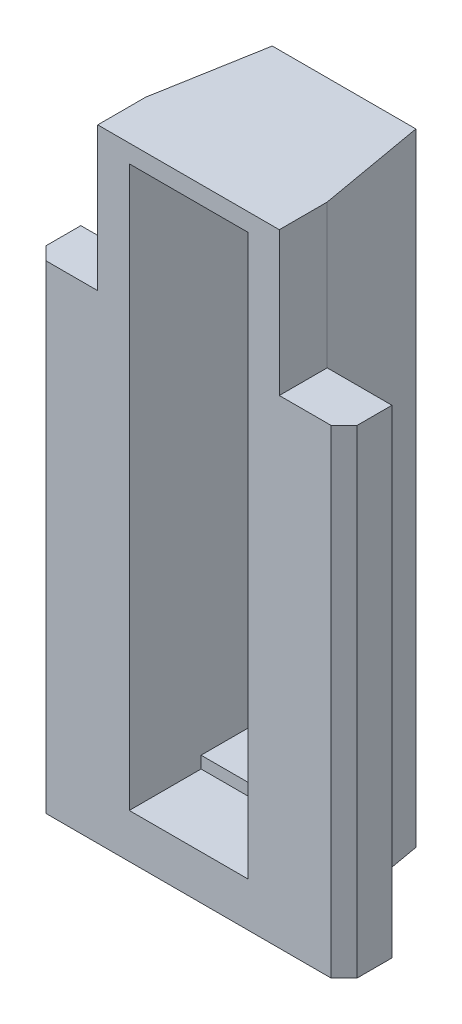
ISO-10303-21;
HEADER;
FILE_DESCRIPTION(('STEP AP214'),'2;1');
FILE_NAME('part.step','',(''),(''),'','','');
FILE_SCHEMA(('AUTOMOTIVE_DESIGN { 1 0 10303 214 1 1 1 1 }'));
ENDSEC;
DATA;
#1=APPLICATION_CONTEXT('core data for automotive mechanical design processes');
#2=APPLICATION_PROTOCOL_DEFINITION('international standard','automotive_design',2000,#1);
#3=PRODUCT_CONTEXT('',#1,'mechanical');
#4=PRODUCT('Part','Part','',(#3));
#5=PRODUCT_RELATED_PRODUCT_CATEGORY('part','',(#4));
#6=PRODUCT_DEFINITION_FORMATION('','',#4);
#7=PRODUCT_DEFINITION_CONTEXT('part definition',#1,'design');
#8=PRODUCT_DEFINITION('design','',#6,#7);
#9=PRODUCT_DEFINITION_SHAPE('','',#8);
#10=(LENGTH_UNIT() NAMED_UNIT(*) SI_UNIT(.MILLI.,.METRE.));
#11=(NAMED_UNIT(*) PLANE_ANGLE_UNIT() SI_UNIT($,.RADIAN.));
#12=(NAMED_UNIT(*) SI_UNIT($,.STERADIAN.) SOLID_ANGLE_UNIT());
#13=UNCERTAINTY_MEASURE_WITH_UNIT(LENGTH_MEASURE(1.E-05),#10,'distance_accuracy_value','');
#14=(GEOMETRIC_REPRESENTATION_CONTEXT(3) GLOBAL_UNCERTAINTY_ASSIGNED_CONTEXT((#13)) GLOBAL_UNIT_ASSIGNED_CONTEXT((#10,
#11,#12)) REPRESENTATION_CONTEXT('',''));
#15=CARTESIAN_POINT('',(0.,0.,0.));
#16=DIRECTION('',(0.,0.,1.));
#17=DIRECTION('',(1.,0.,0.));
#18=AXIS2_PLACEMENT_3D('',#15,#16,#17);
#19=CARTESIAN_POINT('',(0.,6.85,-13.));
#20=DIRECTION('',(0.,0.,1.));
#21=DIRECTION('',(1.,0.,0.));
#22=AXIS2_PLACEMENT_3D('',#19,#20,#21);
#23=CYLINDRICAL_SURFACE('',#22,1.15);
#24=CARTESIAN_POINT('',(0.,6.85,-10.));
#25=DIRECTION('',(0.,0.,1.));
#26=DIRECTION('',(-1.,0.,0.));
#27=AXIS2_PLACEMENT_3D('',#24,#25,#26);
#28=CIRCLE('',#27,1.15);
#29=CARTESIAN_POINT('',(-1.14999999999999,6.85,-10.));
#30=VERTEX_POINT('',#29);
#31=EDGE_CURVE('E410',#30,#30,#28,.T.);
#32=ORIENTED_EDGE('',*,*,#31,.T.);
#33=EDGE_LOOP('',(#32));
#34=FACE_BOUND('',#33,.T.);
#35=CARTESIAN_POINT('',(0.,6.85,-11.8));
#36=DIRECTION('',(0.,0.,-1.));
#37=DIRECTION('',(-1.,0.,0.));
#38=AXIS2_PLACEMENT_3D('',#35,#36,#37);
#39=CIRCLE('',#38,1.15);
#40=CARTESIAN_POINT('',(-1.14999999999999,6.85,-11.8));
#41=VERTEX_POINT('',#40);
#42=EDGE_CURVE('E44',#41,#41,#39,.F.);
#43=ORIENTED_EDGE('',*,*,#42,.F.);
#44=EDGE_LOOP('',(#43));
#45=FACE_BOUND('',#44,.T.);
#46=ADVANCED_FACE('F39',(#34,#45),#23,.F.);
#47=CARTESIAN_POINT('',(0.,47.85,-13.));
#48=DIRECTION('',(0.,0.,1.));
#49=DIRECTION('',(1.,0.,0.));
#50=AXIS2_PLACEMENT_3D('',#47,#48,#49);
#51=CYLINDRICAL_SURFACE('',#50,1.15);
#52=CARTESIAN_POINT('',(0.,47.85,-10.));
#53=DIRECTION('',(0.,0.,1.));
#54=DIRECTION('',(1.,0.,0.));
#55=AXIS2_PLACEMENT_3D('',#52,#53,#54);
#56=CIRCLE('',#55,1.15);
#57=CARTESIAN_POINT('',(1.15,47.85,-10.));
#58=VERTEX_POINT('',#57);
#59=EDGE_CURVE('E254',#58,#58,#56,.T.);
#60=ORIENTED_EDGE('',*,*,#59,.T.);
#61=EDGE_LOOP('',(#60));
#62=FACE_BOUND('',#61,.T.);
#63=CARTESIAN_POINT('',(0.,47.85,-11.8));
#64=DIRECTION('',(0.,0.,-1.));
#65=DIRECTION('',(-1.,0.,0.));
#66=AXIS2_PLACEMENT_3D('',#63,#64,#65);
#67=CIRCLE('',#66,1.15);
#68=CARTESIAN_POINT('',(-1.15,47.85,-11.8));
#69=VERTEX_POINT('',#68);
#70=EDGE_CURVE('E404',#69,#69,#67,.F.);
#71=ORIENTED_EDGE('',*,*,#70,.F.);
#72=EDGE_LOOP('',(#71));
#73=FACE_BOUND('',#72,.T.);
#74=ADVANCED_FACE('F464',(#62,#73),#51,.F.);
#75=CARTESIAN_POINT('',(-4.95000000000001,4.7,-59.3691707926722));
#76=DIRECTION('',(0.,-1.,0.));
#77=DIRECTION('',(0.,0.,-1.));
#78=AXIS2_PLACEMENT_3D('',#75,#76,#77);
#79=PLANE('',#78);
#80=DIRECTION('',(1.,0.,0.));
#81=VECTOR('',#80,1.);
#82=CARTESIAN_POINT('',(-4.95000000000001,4.7,-6.));
#83=LINE('',#82,#81);
#84=CARTESIAN_POINT('',(-4.95000000000001,4.7,-6.));
#85=VERTEX_POINT('',#84);
#86=CARTESIAN_POINT('',(4.94999999999999,4.7,-6.));
#87=VERTEX_POINT('',#86);
#88=EDGE_CURVE('E57',#85,#87,#83,.T.);
#89=ORIENTED_EDGE('',*,*,#88,.T.);
#90=DIRECTION('',(0.,0.,1.));
#91=VECTOR('',#90,1.);
#92=CARTESIAN_POINT('',(4.94999999999999,4.7,-59.3691707926722));
#93=LINE('',#92,#91);
#94=CARTESIAN_POINT('',(4.94999999999999,4.7,-10.));
#95=VERTEX_POINT('',#94);
#96=EDGE_CURVE('E291',#95,#87,#93,.T.);
#97=ORIENTED_EDGE('',*,*,#96,.F.);
#98=DIRECTION('',(-1.,0.,0.));
#99=VECTOR('',#98,1.);
#100=CARTESIAN_POINT('',(-4.95000000000001,4.7,-9.99999999999999));
#101=LINE('',#100,#99);
#102=CARTESIAN_POINT('',(-4.95000000000001,4.7,-9.99999999999999));
#103=VERTEX_POINT('',#102);
#104=EDGE_CURVE('E290',#95,#103,#101,.T.);
#105=ORIENTED_EDGE('',*,*,#104,.T.);
#106=DIRECTION('',(0.,0.,1.));
#107=VECTOR('',#106,1.);
#108=CARTESIAN_POINT('',(-4.95000000000001,4.7,-59.3691707926722));
#109=LINE('',#108,#107);
#110=EDGE_CURVE('E300',#103,#85,#109,.T.);
#111=ORIENTED_EDGE('',*,*,#110,.T.);
#112=EDGE_LOOP('',(#89,#97,#105,#111));
#113=FACE_BOUND('',#112,.T.);
#114=ADVANCED_FACE('F445',(#113),#79,.F.);
#115=CARTESIAN_POINT('',(-4.95000000000001,50.,-59.3691707926722));
#116=DIRECTION('',(0.,1.,0.));
#117=DIRECTION('',(0.,0.,1.));
#118=AXIS2_PLACEMENT_3D('',#115,#116,#117);
#119=PLANE('',#118);
#120=DIRECTION('',(-1.,0.,0.));
#121=VECTOR('',#120,1.);
#122=CARTESIAN_POINT('',(-4.95000000000001,50.,-6.));
#123=LINE('',#122,#121);
#124=CARTESIAN_POINT('',(4.94999999999999,50.,-6.));
#125=VERTEX_POINT('',#124);
#126=CARTESIAN_POINT('',(-4.95000000000001,50.,-6.));
#127=VERTEX_POINT('',#126);
#128=EDGE_CURVE('E244',#125,#127,#123,.T.);
#129=ORIENTED_EDGE('',*,*,#128,.T.);
#130=DIRECTION('',(0.,0.,1.));
#131=VECTOR('',#130,1.);
#132=CARTESIAN_POINT('',(-4.95000000000001,50.,-59.3691707926722));
#133=LINE('',#132,#131);
#134=CARTESIAN_POINT('',(-4.95000000000001,50.,-9.99999999999999));
#135=VERTEX_POINT('',#134);
#136=EDGE_CURVE('E303',#135,#127,#133,.T.);
#137=ORIENTED_EDGE('',*,*,#136,.F.);
#138=DIRECTION('',(1.,0.,0.));
#139=VECTOR('',#138,1.);
#140=CARTESIAN_POINT('',(-4.95000000000001,50.,-9.99999999999999));
#141=LINE('',#140,#139);
#142=CARTESIAN_POINT('',(4.94999999999999,50.,-10.));
#143=VERTEX_POINT('',#142);
#144=EDGE_CURVE('E294',#135,#143,#141,.T.);
#145=ORIENTED_EDGE('',*,*,#144,.T.);
#146=DIRECTION('',(0.,0.,1.));
#147=VECTOR('',#146,1.);
#148=CARTESIAN_POINT('',(4.94999999999999,50.,-59.3691707926722));
#149=LINE('',#148,#147);
#150=EDGE_CURVE('E297',#143,#125,#149,.T.);
#151=ORIENTED_EDGE('',*,*,#150,.T.);
#152=EDGE_LOOP('',(#129,#137,#145,#151));
#153=FACE_BOUND('',#152,.T.);
#154=ADVANCED_FACE('F437',(#153),#119,.F.);
#155=CARTESIAN_POINT('',(0.,40.,0.));
#156=DIRECTION('',(0.,1.,0.));
#157=DIRECTION('',(0.,0.,1.));
#158=AXIS2_PLACEMENT_3D('',#155,#156,#157);
#159=PLANE('',#158);
#160=DIRECTION('',(1.,0.,0.));
#161=VECTOR('',#160,1.);
#162=CARTESIAN_POINT('',(-13.,40.,0.));
#163=LINE('',#162,#161);
#164=CARTESIAN_POINT('',(7.58694282637616,40.,0.));
#165=VERTEX_POINT('',#164);
#166=CARTESIAN_POINT('',(11.9,40.,0.));
#167=VERTEX_POINT('',#166);
#168=EDGE_CURVE('E353',#165,#167,#163,.T.);
#169=ORIENTED_EDGE('',*,*,#168,.T.);
#170=DIRECTION('',(-0.707106781186549,0.,0.707106781186546));
#171=VECTOR('',#170,1.);
#172=CARTESIAN_POINT('',(5.94999999999997,40.,5.94999999999999));
#173=LINE('',#172,#171);
#174=CARTESIAN_POINT('',(13.,40.,-1.1));
#175=VERTEX_POINT('',#174);
#176=EDGE_CURVE('E402',#167,#175,#173,.F.);
#177=ORIENTED_EDGE('',*,*,#176,.T.);
#178=DIRECTION('',(0.,0.,-1.));
#179=VECTOR('',#178,1.);
#180=CARTESIAN_POINT('',(13.,40.,0.));
#181=LINE('',#180,#179);
#182=CARTESIAN_POINT('',(13.,40.,-4.));
#183=VERTEX_POINT('',#182);
#184=EDGE_CURVE('E343',#175,#183,#181,.T.);
#185=ORIENTED_EDGE('',*,*,#184,.T.);
#186=DIRECTION('',(-1.,0.,0.));
#187=VECTOR('',#186,1.);
#188=CARTESIAN_POINT('',(13.,40.,-4.));
#189=LINE('',#188,#187);
#190=CARTESIAN_POINT('',(7.58694282637617,40.,-4.));
#191=VERTEX_POINT('',#190);
#192=EDGE_CURVE('E345',#183,#191,#189,.T.);
#193=ORIENTED_EDGE('',*,*,#192,.T.);
#194=DIRECTION('',(0.,0.,-1.));
#195=VECTOR('',#194,1.);
#196=CARTESIAN_POINT('',(7.58694282637616,40.,0.));
#197=LINE('',#196,#195);
#198=EDGE_CURVE('E309',#165,#191,#197,.T.);
#199=ORIENTED_EDGE('',*,*,#198,.F.);
#200=EDGE_LOOP('',(#169,#177,#185,#193,#199));
#201=FACE_BOUND('',#200,.T.);
#202=ADVANCED_FACE('F506',(#201),#159,.T.);
#203=CARTESIAN_POINT('',(13.,40.,0.));
#204=DIRECTION('',(-1.,0.,0.));
#205=DIRECTION('',(0.,0.,1.));
#206=AXIS2_PLACEMENT_3D('',#203,#204,#205);
#207=PLANE('',#206);
#208=ORIENTED_EDGE('',*,*,#184,.F.);
#209=DIRECTION('',(0.,-1.,0.));
#210=VECTOR('',#209,1.);
#211=CARTESIAN_POINT('',(13.,40.,-1.1));
#212=LINE('',#211,#210);
#213=CARTESIAN_POINT('',(13.,0.,-1.1));
#214=VERTEX_POINT('',#213);
#215=EDGE_CURVE('E390',#175,#214,#212,.T.);
#216=ORIENTED_EDGE('',*,*,#215,.T.);
#217=DIRECTION('',(0.,0.,-1.));
#218=VECTOR('',#217,1.);
#219=CARTESIAN_POINT('',(13.,0.,0.));
#220=LINE('',#219,#218);
#221=CARTESIAN_POINT('',(13.,0.,-4.));
#222=VERTEX_POINT('',#221);
#223=EDGE_CURVE('E342',#214,#222,#220,.T.);
#224=ORIENTED_EDGE('',*,*,#223,.T.);
#225=DIRECTION('',(0.,-1.,0.));
#226=VECTOR('',#225,1.);
#227=CARTESIAN_POINT('',(13.,40.,-4.));
#228=LINE('',#227,#226);
#229=EDGE_CURVE('E387',#183,#222,#228,.T.);
#230=ORIENTED_EDGE('',*,*,#229,.F.);
#231=EDGE_LOOP('',(#208,#216,#224,#230));
#232=FACE_BOUND('',#231,.T.);
#233=ADVANCED_FACE('F555',(#232),#207,.F.);
#234=CARTESIAN_POINT('',(13.,40.,-4.));
#235=DIRECTION('',(0.,0.,1.));
#236=DIRECTION('',(1.,0.,0.));
#237=AXIS2_PLACEMENT_3D('',#234,#235,#236);
#238=PLANE('',#237);
#239=DIRECTION('',(-1.,0.,0.));
#240=VECTOR('',#239,1.);
#241=CARTESIAN_POINT('',(13.,0.,-4.));
#242=LINE('',#241,#240);
#243=CARTESIAN_POINT('',(7.58694282637617,0.,-4.));
#244=VERTEX_POINT('',#243);
#245=EDGE_CURVE('E358',#222,#244,#242,.T.);
#246=ORIENTED_EDGE('',*,*,#245,.T.);
#247=DIRECTION('',(0.,-1.,0.));
#248=VECTOR('',#247,1.);
#249=CARTESIAN_POINT('',(7.58694282637617,40.,-4.));
#250=LINE('',#249,#248);
#251=EDGE_CURVE('E384',#191,#244,#250,.T.);
#252=ORIENTED_EDGE('',*,*,#251,.F.);
#253=ORIENTED_EDGE('',*,*,#192,.F.);
#254=ORIENTED_EDGE('',*,*,#229,.T.);
#255=EDGE_LOOP('',(#246,#252,#253,#254));
#256=FACE_BOUND('',#255,.T.);
#257=ADVANCED_FACE('F551',(#256),#238,.F.);
#258=CARTESIAN_POINT('',(7.58694282637617,40.,-4.));
#259=DIRECTION('',(-0.984807753012208,0.,0.173648177666929));
#260=DIRECTION('',(0.173648177666929,0.,0.984807753012208));
#261=AXIS2_PLACEMENT_3D('',#258,#259,#260);
#262=PLANE('',#261);
#263=DIRECTION('',(-0.173648177666929,0.,-0.984807753012208));
#264=VECTOR('',#263,1.);
#265=CARTESIAN_POINT('',(7.58694282637617,0.,-4.));
#266=LINE('',#265,#264);
#267=CARTESIAN_POINT('',(6.,0.,-13.));
#268=VERTEX_POINT('',#267);
#269=EDGE_CURVE('E360',#244,#268,#266,.T.);
#270=ORIENTED_EDGE('',*,*,#269,.T.);
#271=DIRECTION('',(0.,-1.,0.));
#272=VECTOR('',#271,1.);
#273=CARTESIAN_POINT('',(6.,40.,-13.));
#274=LINE('',#273,#272);
#275=CARTESIAN_POINT('',(6.,52.,-13.));
#276=VERTEX_POINT('',#275);
#277=EDGE_CURVE('E381',#276,#268,#274,.T.);
#278=ORIENTED_EDGE('',*,*,#277,.F.);
#279=DIRECTION('',(-0.173648177666929,0.,-0.984807753012208));
#280=VECTOR('',#279,1.);
#281=CARTESIAN_POINT('',(7.58694282637617,52.,-4.));
#282=LINE('',#281,#280);
#283=CARTESIAN_POINT('',(7.58694282637617,52.,-4.));
#284=VERTEX_POINT('',#283);
#285=EDGE_CURVE('E313',#284,#276,#282,.T.);
#286=ORIENTED_EDGE('',*,*,#285,.F.);
#287=DIRECTION('',(0.,-1.,0.));
#288=VECTOR('',#287,1.);
#289=CARTESIAN_POINT('',(7.58694282637617,52.,-4.));
#290=LINE('',#289,#288);
#291=EDGE_CURVE('E339',#284,#191,#290,.T.);
#292=ORIENTED_EDGE('',*,*,#291,.T.);
#293=ORIENTED_EDGE('',*,*,#251,.T.);
#294=EDGE_LOOP('',(#270,#278,#286,#292,#293));
#295=FACE_BOUND('',#294,.T.);
#296=ADVANCED_FACE('F547',(#295),#262,.F.);
#297=CARTESIAN_POINT('',(6.,40.,-13.));
#298=DIRECTION('',(0.,0.,1.));
#299=DIRECTION('',(1.,0.,0.));
#300=AXIS2_PLACEMENT_3D('',#297,#298,#299);
#301=PLANE('',#300);
#302=CARTESIAN_POINT('',(0.,47.85,-13.));
#303=DIRECTION('',(0.,0.,-1.));
#304=DIRECTION('',(-1.,0.,0.));
#305=AXIS2_PLACEMENT_3D('',#302,#303,#304);
#306=CIRCLE('',#305,1.95);
#307=CARTESIAN_POINT('',(-1.95,47.85,-13.));
#308=VERTEX_POINT('',#307);
#309=EDGE_CURVE('E412',#308,#308,#306,.T.);
#310=ORIENTED_EDGE('',*,*,#309,.F.);
#311=EDGE_LOOP('',(#310));
#312=FACE_BOUND('',#311,.T.);
#313=CARTESIAN_POINT('',(0.,6.85,-13.));
#314=DIRECTION('',(0.,0.,-1.));
#315=DIRECTION('',(-1.,0.,0.));
#316=AXIS2_PLACEMENT_3D('',#313,#314,#315);
#317=CIRCLE('',#316,1.95);
#318=CARTESIAN_POINT('',(-1.94999999999999,6.85,-13.));
#319=VERTEX_POINT('',#318);
#320=EDGE_CURVE('E422',#319,#319,#317,.T.);
#321=ORIENTED_EDGE('',*,*,#320,.F.);
#322=EDGE_LOOP('',(#321));
#323=FACE_BOUND('',#322,.T.);
#324=DIRECTION('',(1.,0.,0.));
#325=VECTOR('',#324,1.);
#326=CARTESIAN_POINT('',(-1.75,9.85000000000001,-13.));
#327=LINE('',#326,#325);
#328=CARTESIAN_POINT('',(-1.75,9.85000000000001,-13.));
#329=VERTEX_POINT('',#328);
#330=CARTESIAN_POINT('',(1.75,9.85000000000001,-13.));
#331=VERTEX_POINT('',#330);
#332=EDGE_CURVE('E268',#329,#331,#327,.T.);
#333=ORIENTED_EDGE('',*,*,#332,.T.);
#334=DIRECTION('',(0.,1.,0.));
#335=VECTOR('',#334,1.);
#336=CARTESIAN_POINT('',(1.75,9.85000000000001,-13.));
#337=LINE('',#336,#335);
#338=CARTESIAN_POINT('',(1.75,44.85,-13.));
#339=VERTEX_POINT('',#338);
#340=EDGE_CURVE('E258',#331,#339,#337,.T.);
#341=ORIENTED_EDGE('',*,*,#340,.T.);
#342=DIRECTION('',(-1.,0.,0.));
#343=VECTOR('',#342,1.);
#344=CARTESIAN_POINT('',(-1.75,44.85,-13.));
#345=LINE('',#344,#343);
#346=CARTESIAN_POINT('',(-1.75,44.85,-13.));
#347=VERTEX_POINT('',#346);
#348=EDGE_CURVE('E261',#339,#347,#345,.T.);
#349=ORIENTED_EDGE('',*,*,#348,.T.);
#350=DIRECTION('',(0.,-1.,0.));
#351=VECTOR('',#350,1.);
#352=CARTESIAN_POINT('',(-1.75,9.85000000000001,-13.));
#353=LINE('',#352,#351);
#354=EDGE_CURVE('E265',#347,#329,#353,.T.);
#355=ORIENTED_EDGE('',*,*,#354,.T.);
#356=EDGE_LOOP('',(#333,#341,#349,#355));
#357=FACE_BOUND('',#356,.T.);
#358=DIRECTION('',(-1.,0.,0.));
#359=VECTOR('',#358,1.);
#360=CARTESIAN_POINT('',(6.,0.,-13.));
#361=LINE('',#360,#359);
#362=CARTESIAN_POINT('',(-6.,0.,-13.));
#363=VERTEX_POINT('',#362);
#364=EDGE_CURVE('E362',#268,#363,#361,.T.);
#365=ORIENTED_EDGE('',*,*,#364,.T.);
#366=DIRECTION('',(0.,-1.,0.));
#367=VECTOR('',#366,1.);
#368=CARTESIAN_POINT('',(-6.,40.,-13.));
#369=LINE('',#368,#367);
#370=CARTESIAN_POINT('',(-6.,52.,-13.));
#371=VERTEX_POINT('',#370);
#372=EDGE_CURVE('E378',#371,#363,#369,.T.);
#373=ORIENTED_EDGE('',*,*,#372,.F.);
#374=DIRECTION('',(-1.,0.,0.));
#375=VECTOR('',#374,1.);
#376=CARTESIAN_POINT('',(6.,52.,-13.));
#377=LINE('',#376,#375);
#378=EDGE_CURVE('E317',#276,#371,#377,.T.);
#379=ORIENTED_EDGE('',*,*,#378,.F.);
#380=ORIENTED_EDGE('',*,*,#277,.T.);
#381=EDGE_LOOP('',(#365,#373,#379,#380));
#382=FACE_BOUND('',#381,.T.);
#383=ADVANCED_FACE('F543',(#312,#323,#357,#382),#301,.F.);
#384=CARTESIAN_POINT('',(-7.58694282637617,40.,-4.));
#385=DIRECTION('',(0.984807753012208,0.,0.173648177666929));
#386=DIRECTION('',(0.173648177666929,0.,-0.984807753012208));
#387=AXIS2_PLACEMENT_3D('',#384,#385,#386);
#388=PLANE('',#387);
#389=DIRECTION('',(-0.173648177666929,0.,0.984807753012208));
#390=VECTOR('',#389,1.);
#391=CARTESIAN_POINT('',(-7.58694282637617,0.,-4.));
#392=LINE('',#391,#390);
#393=CARTESIAN_POINT('',(-7.58694282637617,0.,-4.));
#394=VERTEX_POINT('',#393);
#395=EDGE_CURVE('E364',#363,#394,#392,.T.);
#396=ORIENTED_EDGE('',*,*,#395,.T.);
#397=DIRECTION('',(0.,-1.,0.));
#398=VECTOR('',#397,1.);
#399=CARTESIAN_POINT('',(-7.58694282637617,40.,-4.));
#400=LINE('',#399,#398);
#401=CARTESIAN_POINT('',(-7.58694282637617,40.,-4.));
#402=VERTEX_POINT('',#401);
#403=EDGE_CURVE('E375',#402,#394,#400,.T.);
#404=ORIENTED_EDGE('',*,*,#403,.F.);
#405=DIRECTION('',(0.,-1.,0.));
#406=VECTOR('',#405,1.);
#407=CARTESIAN_POINT('',(-7.58694282637617,52.,-4.));
#408=LINE('',#407,#406);
#409=CARTESIAN_POINT('',(-7.58694282637617,52.,-4.));
#410=VERTEX_POINT('',#409);
#411=EDGE_CURVE('E336',#410,#402,#408,.T.);
#412=ORIENTED_EDGE('',*,*,#411,.F.);
#413=DIRECTION('',(-0.173648177666929,0.,0.984807753012208));
#414=VECTOR('',#413,1.);
#415=CARTESIAN_POINT('',(-6.,52.,-13.));
#416=LINE('',#415,#414);
#417=EDGE_CURVE('E320',#371,#410,#416,.T.);
#418=ORIENTED_EDGE('',*,*,#417,.F.);
#419=ORIENTED_EDGE('',*,*,#372,.T.);
#420=EDGE_LOOP('',(#396,#404,#412,#418,#419));
#421=FACE_BOUND('',#420,.T.);
#422=ADVANCED_FACE('F539',(#421),#388,.F.);
#423=CARTESIAN_POINT('',(-13.,40.,-4.));
#424=DIRECTION('',(0.,0.,1.));
#425=DIRECTION('',(1.,0.,0.));
#426=AXIS2_PLACEMENT_3D('',#423,#424,#425);
#427=PLANE('',#426);
#428=DIRECTION('',(-1.,0.,0.));
#429=VECTOR('',#428,1.);
#430=CARTESIAN_POINT('',(-13.,0.,-4.));
#431=LINE('',#430,#429);
#432=CARTESIAN_POINT('',(-13.,0.,-4.));
#433=VERTEX_POINT('',#432);
#434=EDGE_CURVE('E366',#394,#433,#431,.T.);
#435=ORIENTED_EDGE('',*,*,#434,.T.);
#436=DIRECTION('',(0.,-1.,0.));
#437=VECTOR('',#436,1.);
#438=CARTESIAN_POINT('',(-13.,40.,-4.));
#439=LINE('',#438,#437);
#440=CARTESIAN_POINT('',(-13.,40.,-4.));
#441=VERTEX_POINT('',#440);
#442=EDGE_CURVE('E356',#441,#433,#439,.T.);
#443=ORIENTED_EDGE('',*,*,#442,.F.);
#444=DIRECTION('',(-1.,0.,0.));
#445=VECTOR('',#444,1.);
#446=CARTESIAN_POINT('',(-13.,40.,-4.));
#447=LINE('',#446,#445);
#448=EDGE_CURVE('E348',#402,#441,#447,.T.);
#449=ORIENTED_EDGE('',*,*,#448,.F.);
#450=ORIENTED_EDGE('',*,*,#403,.T.);
#451=EDGE_LOOP('',(#435,#443,#449,#450));
#452=FACE_BOUND('',#451,.T.);
#453=ADVANCED_FACE('F535',(#452),#427,.F.);
#454=CARTESIAN_POINT('',(-13.,40.,0.));
#455=DIRECTION('',(1.,0.,0.));
#456=DIRECTION('',(0.,0.,-1.));
#457=AXIS2_PLACEMENT_3D('',#454,#455,#456);
#458=PLANE('',#457);
#459=DIRECTION('',(0.,0.,1.));
#460=VECTOR('',#459,1.);
#461=CARTESIAN_POINT('',(-13.,0.,0.));
#462=LINE('',#461,#460);
#463=CARTESIAN_POINT('',(-13.,0.,-1.1));
#464=VERTEX_POINT('',#463);
#465=EDGE_CURVE('E368',#433,#464,#462,.T.);
#466=ORIENTED_EDGE('',*,*,#465,.T.);
#467=DIRECTION('',(0.,1.,0.));
#468=VECTOR('',#467,1.);
#469=CARTESIAN_POINT('',(-13.,40.,-1.1));
#470=LINE('',#469,#468);
#471=CARTESIAN_POINT('',(-13.,40.,-1.1));
#472=VERTEX_POINT('',#471);
#473=EDGE_CURVE('E49',#464,#472,#470,.T.);
#474=ORIENTED_EDGE('',*,*,#473,.T.);
#475=DIRECTION('',(0.,0.,1.));
#476=VECTOR('',#475,1.);
#477=CARTESIAN_POINT('',(-13.,40.,0.));
#478=LINE('',#477,#476);
#479=EDGE_CURVE('E350',#441,#472,#478,.T.);
#480=ORIENTED_EDGE('',*,*,#479,.F.);
#481=ORIENTED_EDGE('',*,*,#442,.T.);
#482=EDGE_LOOP('',(#466,#474,#480,#481));
#483=FACE_BOUND('',#482,.T.);
#484=ADVANCED_FACE('F532',(#483),#458,.F.);
#485=CARTESIAN_POINT('',(-13.,40.,0.));
#486=DIRECTION('',(0.,0.,-1.));
#487=DIRECTION('',(-1.,0.,0.));
#488=AXIS2_PLACEMENT_3D('',#485,#486,#487);
#489=PLANE('',#488);
#490=DIRECTION('',(0.,-1.,0.));
#491=VECTOR('',#490,1.);
#492=CARTESIAN_POINT('',(-4.95000000000001,4.7,0.));
#493=LINE('',#492,#491);
#494=CARTESIAN_POINT('',(-4.95000000000001,50.5,0.));
#495=VERTEX_POINT('',#494);
#496=CARTESIAN_POINT('',(-4.95000000000001,3.7,0.));
#497=VERTEX_POINT('',#496);
#498=EDGE_CURVE('E220',#495,#497,#493,.T.);
#499=ORIENTED_EDGE('',*,*,#498,.F.);
#500=DIRECTION('',(-1.,0.,0.));
#501=VECTOR('',#500,1.);
#502=CARTESIAN_POINT('',(-4.95000000000001,50.5,0.));
#503=LINE('',#502,#501);
#504=CARTESIAN_POINT('',(4.94999999999999,50.5,0.));
#505=VERTEX_POINT('',#504);
#506=EDGE_CURVE('E227',#505,#495,#503,.T.);
#507=ORIENTED_EDGE('',*,*,#506,.F.);
#508=DIRECTION('',(0.,1.,0.));
#509=VECTOR('',#508,1.);
#510=CARTESIAN_POINT('',(4.94999999999999,4.7,0.));
#511=LINE('',#510,#509);
#512=CARTESIAN_POINT('',(4.94999999999999,3.7,0.));
#513=VERTEX_POINT('',#512);
#514=EDGE_CURVE('E210',#513,#505,#511,.T.);
#515=ORIENTED_EDGE('',*,*,#514,.F.);
#516=DIRECTION('',(1.,0.,0.));
#517=VECTOR('',#516,1.);
#518=CARTESIAN_POINT('',(-4.95000000000001,3.7,0.));
#519=LINE('',#518,#517);
#520=EDGE_CURVE('E251',#497,#513,#519,.T.);
#521=ORIENTED_EDGE('',*,*,#520,.F.);
#522=EDGE_LOOP('',(#499,#507,#515,#521));
#523=FACE_BOUND('',#522,.T.);
#524=DIRECTION('',(1.,0.,0.));
#525=VECTOR('',#524,1.);
#526=CARTESIAN_POINT('',(-13.,0.,0.));
#527=LINE('',#526,#525);
#528=CARTESIAN_POINT('',(-11.9,0.,0.));
#529=VERTEX_POINT('',#528);
#530=CARTESIAN_POINT('',(11.9,0.,0.));
#531=VERTEX_POINT('',#530);
#532=EDGE_CURVE('E346',#529,#531,#527,.T.);
#533=ORIENTED_EDGE('',*,*,#532,.T.);
#534=DIRECTION('',(0.,1.,0.));
#535=VECTOR('',#534,1.);
#536=CARTESIAN_POINT('',(11.9,40.,0.));
#537=LINE('',#536,#535);
#538=EDGE_CURVE('E400',#531,#167,#537,.T.);
#539=ORIENTED_EDGE('',*,*,#538,.T.);
#540=ORIENTED_EDGE('',*,*,#168,.F.);
#541=DIRECTION('',(0.,-1.,0.));
#542=VECTOR('',#541,1.);
#543=CARTESIAN_POINT('',(7.58694282637616,52.,0.));
#544=LINE('',#543,#542);
#545=CARTESIAN_POINT('',(7.58694282637616,52.,0.));
#546=VERTEX_POINT('',#545);
#547=EDGE_CURVE('E326',#546,#165,#544,.T.);
#548=ORIENTED_EDGE('',*,*,#547,.F.);
#549=DIRECTION('',(1.,0.,0.));
#550=VECTOR('',#549,1.);
#551=CARTESIAN_POINT('',(-7.58694282637617,52.,0.));
#552=LINE('',#551,#550);
#553=CARTESIAN_POINT('',(-7.58694282637617,52.,0.));
#554=VERTEX_POINT('',#553);
#555=EDGE_CURVE('E324',#554,#546,#552,.T.);
#556=ORIENTED_EDGE('',*,*,#555,.F.);
#557=DIRECTION('',(0.,-1.,0.));
#558=VECTOR('',#557,1.);
#559=CARTESIAN_POINT('',(-7.58694282637617,52.,0.));
#560=LINE('',#559,#558);
#561=CARTESIAN_POINT('',(-7.58694282637617,40.,0.));
#562=VERTEX_POINT('',#561);
#563=EDGE_CURVE('E333',#554,#562,#560,.T.);
#564=ORIENTED_EDGE('',*,*,#563,.T.);
#565=CARTESIAN_POINT('',(-11.9,40.,0.));
#566=VERTEX_POINT('',#565);
#567=EDGE_CURVE('E354',#566,#562,#163,.T.);
#568=ORIENTED_EDGE('',*,*,#567,.F.);
#569=DIRECTION('',(0.,-1.,0.));
#570=VECTOR('',#569,1.);
#571=CARTESIAN_POINT('',(-11.9,40.,0.));
#572=LINE('',#571,#570);
#573=EDGE_CURVE('E397',#566,#529,#572,.T.);
#574=ORIENTED_EDGE('',*,*,#573,.T.);
#575=EDGE_LOOP('',(#533,#539,#540,#548,#556,#564,#568,#574));
#576=FACE_BOUND('',#575,.T.);
#577=ADVANCED_FACE('F232',(#523,#576),#489,.F.);
#578=ORIENTED_EDGE('',*,*,#479,.T.);
#579=DIRECTION('',(-0.707106781186545,0.,-0.70710678118655));
#580=VECTOR('',#579,1.);
#581=CARTESIAN_POINT('',(-5.95000000000004,40.,5.95));
#582=LINE('',#581,#580);
#583=EDGE_CURVE('E13',#472,#566,#582,.F.);
#584=ORIENTED_EDGE('',*,*,#583,.T.);
#585=ORIENTED_EDGE('',*,*,#567,.T.);
#586=DIRECTION('',(0.,0.,1.));
#587=VECTOR('',#586,1.);
#588=CARTESIAN_POINT('',(-7.58694282637617,40.,-4.));
#589=LINE('',#588,#587);
#590=EDGE_CURVE('E314',#402,#562,#589,.T.);
#591=ORIENTED_EDGE('',*,*,#590,.F.);
#592=ORIENTED_EDGE('',*,*,#448,.T.);
#593=EDGE_LOOP('',(#578,#584,#585,#591,#592));
#594=FACE_BOUND('',#593,.T.);
#595=ADVANCED_FACE('F523',(#594),#159,.T.);
#596=CARTESIAN_POINT('',(0.,0.,0.));
#597=DIRECTION('',(0.,1.,0.));
#598=DIRECTION('',(0.,0.,1.));
#599=AXIS2_PLACEMENT_3D('',#596,#597,#598);
#600=PLANE('',#599);
#601=ORIENTED_EDGE('',*,*,#223,.F.);
#602=DIRECTION('',(0.707106781186549,0.,-0.707106781186546));
#603=VECTOR('',#602,1.);
#604=CARTESIAN_POINT('',(13.,0.,-1.1));
#605=LINE('',#604,#603);
#606=EDGE_CURVE('E395',#214,#531,#605,.F.);
#607=ORIENTED_EDGE('',*,*,#606,.T.);
#608=ORIENTED_EDGE('',*,*,#532,.F.);
#609=DIRECTION('',(0.707106781186545,0.,0.70710678118655));
#610=VECTOR('',#609,1.);
#611=CARTESIAN_POINT('',(-11.9,0.,0.));
#612=LINE('',#611,#610);
#613=EDGE_CURVE('E393',#529,#464,#612,.F.);
#614=ORIENTED_EDGE('',*,*,#613,.T.);
#615=ORIENTED_EDGE('',*,*,#465,.F.);
#616=ORIENTED_EDGE('',*,*,#434,.F.);
#617=ORIENTED_EDGE('',*,*,#395,.F.);
#618=ORIENTED_EDGE('',*,*,#364,.F.);
#619=ORIENTED_EDGE('',*,*,#269,.F.);
#620=ORIENTED_EDGE('',*,*,#245,.F.);
#621=EDGE_LOOP('',(#601,#607,#608,#614,#615,#616,#617,#618,#619,#620));
#622=FACE_BOUND('',#621,.T.);
#623=ADVANCED_FACE('F521',(#622),#600,.F.);
#624=CARTESIAN_POINT('',(7.58694282637616,52.,0.));
#625=DIRECTION('',(-1.,0.,0.));
#626=DIRECTION('',(0.,0.,1.));
#627=AXIS2_PLACEMENT_3D('',#624,#625,#626);
#628=PLANE('',#627);
#629=ORIENTED_EDGE('',*,*,#198,.T.);
#630=ORIENTED_EDGE('',*,*,#291,.F.);
#631=DIRECTION('',(0.,0.,-1.));
#632=VECTOR('',#631,1.);
#633=CARTESIAN_POINT('',(7.58694282637616,52.,0.));
#634=LINE('',#633,#632);
#635=EDGE_CURVE('E310',#546,#284,#634,.T.);
#636=ORIENTED_EDGE('',*,*,#635,.F.);
#637=ORIENTED_EDGE('',*,*,#547,.T.);
#638=EDGE_LOOP('',(#629,#630,#636,#637));
#639=FACE_BOUND('',#638,.T.);
#640=ADVANCED_FACE('F517',(#639),#628,.F.);
#641=CARTESIAN_POINT('',(-7.58694282637617,52.,-4.));
#642=DIRECTION('',(1.,0.,0.));
#643=DIRECTION('',(0.,0.,-1.));
#644=AXIS2_PLACEMENT_3D('',#641,#642,#643);
#645=PLANE('',#644);
#646=ORIENTED_EDGE('',*,*,#590,.T.);
#647=ORIENTED_EDGE('',*,*,#563,.F.);
#648=DIRECTION('',(0.,0.,1.));
#649=VECTOR('',#648,1.);
#650=CARTESIAN_POINT('',(-7.58694282637617,52.,-4.));
#651=LINE('',#650,#649);
#652=EDGE_CURVE('E322',#410,#554,#651,.T.);
#653=ORIENTED_EDGE('',*,*,#652,.F.);
#654=ORIENTED_EDGE('',*,*,#411,.T.);
#655=EDGE_LOOP('',(#646,#647,#653,#654));
#656=FACE_BOUND('',#655,.T.);
#657=ADVANCED_FACE('F513',(#656),#645,.F.);
#658=CARTESIAN_POINT('',(0.,52.,0.));
#659=DIRECTION('',(0.,1.,0.));
#660=DIRECTION('',(0.,0.,1.));
#661=AXIS2_PLACEMENT_3D('',#658,#659,#660);
#662=PLANE('',#661);
#663=ORIENTED_EDGE('',*,*,#635,.T.);
#664=ORIENTED_EDGE('',*,*,#285,.T.);
#665=ORIENTED_EDGE('',*,*,#378,.T.);
#666=ORIENTED_EDGE('',*,*,#417,.T.);
#667=ORIENTED_EDGE('',*,*,#652,.T.);
#668=ORIENTED_EDGE('',*,*,#555,.T.);
#669=EDGE_LOOP('',(#663,#664,#665,#666,#667,#668));
#670=FACE_BOUND('',#669,.T.);
#671=ADVANCED_FACE('F509',(#670),#662,.T.);
#672=CARTESIAN_POINT('',(13.,40.,-1.1));
#673=DIRECTION('',(-0.707106781186546,0.,-0.707106781186549));
#674=DIRECTION('',(0.,-1.,0.));
#675=AXIS2_PLACEMENT_3D('',#672,#673,#674);
#676=PLANE('',#675);
#677=ORIENTED_EDGE('',*,*,#176,.F.);
#678=ORIENTED_EDGE('',*,*,#538,.F.);
#679=ORIENTED_EDGE('',*,*,#606,.F.);
#680=ORIENTED_EDGE('',*,*,#215,.F.);
#681=EDGE_LOOP('',(#677,#678,#679,#680));
#682=FACE_BOUND('',#681,.T.);
#683=ADVANCED_FACE('F512',(#682),#676,.F.);
#684=CARTESIAN_POINT('',(-11.9,40.,0.));
#685=DIRECTION('',(0.70710678118655,0.,-0.707106781186545));
#686=DIRECTION('',(0.,-1.,0.));
#687=AXIS2_PLACEMENT_3D('',#684,#685,#686);
#688=PLANE('',#687);
#689=ORIENTED_EDGE('',*,*,#583,.F.);
#690=ORIENTED_EDGE('',*,*,#473,.F.);
#691=ORIENTED_EDGE('',*,*,#613,.F.);
#692=ORIENTED_EDGE('',*,*,#573,.F.);
#693=EDGE_LOOP('',(#689,#690,#691,#692));
#694=FACE_BOUND('',#693,.T.);
#695=ADVANCED_FACE('F42',(#694),#688,.F.);
#696=CARTESIAN_POINT('',(4.94999999999999,4.7,-59.3691707926722));
#697=DIRECTION('',(1.,0.,0.));
#698=DIRECTION('',(0.,0.,-1.));
#699=AXIS2_PLACEMENT_3D('',#696,#697,#698);
#700=PLANE('',#699);
#701=DIRECTION('',(0.,-1.,0.));
#702=VECTOR('',#701,1.);
#703=CARTESIAN_POINT('',(4.94999999999999,4.7,-9.99999999999999));
#704=LINE('',#703,#702);
#705=EDGE_CURVE('E293',#143,#95,#704,.T.);
#706=ORIENTED_EDGE('',*,*,#705,.T.);
#707=ORIENTED_EDGE('',*,*,#96,.T.);
#708=DIRECTION('',(0.,-1.,0.));
#709=VECTOR('',#708,1.);
#710=CARTESIAN_POINT('',(4.94999999999999,4.7,-6.));
#711=LINE('',#710,#709);
#712=CARTESIAN_POINT('',(4.94999999999999,3.7,-6.));
#713=VERTEX_POINT('',#712);
#714=EDGE_CURVE('E247',#87,#713,#711,.T.);
#715=ORIENTED_EDGE('',*,*,#714,.T.);
#716=DIRECTION('',(0.,0.,1.));
#717=VECTOR('',#716,1.);
#718=CARTESIAN_POINT('',(4.94999999999999,3.7,-19.9503768772846));
#719=LINE('',#718,#717);
#720=EDGE_CURVE('E215',#713,#513,#719,.T.);
#721=ORIENTED_EDGE('',*,*,#720,.T.);
#722=ORIENTED_EDGE('',*,*,#514,.T.);
#723=DIRECTION('',(0.,0.,1.));
#724=VECTOR('',#723,1.);
#725=CARTESIAN_POINT('',(4.94999999999999,50.5,-19.9503768772846));
#726=LINE('',#725,#724);
#727=CARTESIAN_POINT('',(4.94999999999999,50.5,-6.));
#728=VERTEX_POINT('',#727);
#729=EDGE_CURVE('E213',#728,#505,#726,.T.);
#730=ORIENTED_EDGE('',*,*,#729,.F.);
#731=DIRECTION('',(0.,-1.,0.));
#732=VECTOR('',#731,1.);
#733=CARTESIAN_POINT('',(4.94999999999999,50.,-6.));
#734=LINE('',#733,#732);
#735=EDGE_CURVE('E242',#728,#125,#734,.T.);
#736=ORIENTED_EDGE('',*,*,#735,.T.);
#737=ORIENTED_EDGE('',*,*,#150,.F.);
#738=EDGE_LOOP('',(#706,#707,#715,#721,#722,#730,#736,#737));
#739=FACE_BOUND('',#738,.T.);
#740=ADVANCED_FACE('F212',(#739),#700,.F.);
#741=CARTESIAN_POINT('',(-4.95000000000001,4.7,-59.3691707926722));
#742=DIRECTION('',(-1.,0.,0.));
#743=DIRECTION('',(0.,0.,1.));
#744=AXIS2_PLACEMENT_3D('',#741,#742,#743);
#745=PLANE('',#744);
#746=DIRECTION('',(0.,1.,0.));
#747=VECTOR('',#746,1.);
#748=CARTESIAN_POINT('',(-4.95000000000001,4.7,-9.99999999999999));
#749=LINE('',#748,#747);
#750=EDGE_CURVE('E288',#103,#135,#749,.T.);
#751=ORIENTED_EDGE('',*,*,#750,.T.);
#752=ORIENTED_EDGE('',*,*,#136,.T.);
#753=DIRECTION('',(0.,1.,0.));
#754=VECTOR('',#753,1.);
#755=CARTESIAN_POINT('',(-4.95000000000001,50.,-6.));
#756=LINE('',#755,#754);
#757=CARTESIAN_POINT('',(-4.95000000000001,50.5,-6.));
#758=VERTEX_POINT('',#757);
#759=EDGE_CURVE('E65',#127,#758,#756,.T.);
#760=ORIENTED_EDGE('',*,*,#759,.T.);
#761=DIRECTION('',(0.,0.,1.));
#762=VECTOR('',#761,1.);
#763=CARTESIAN_POINT('',(-4.95000000000001,50.5,-19.9503768772846));
#764=LINE('',#763,#762);
#765=EDGE_CURVE('E230',#758,#495,#764,.T.);
#766=ORIENTED_EDGE('',*,*,#765,.T.);
#767=ORIENTED_EDGE('',*,*,#498,.T.);
#768=DIRECTION('',(0.,0.,1.));
#769=VECTOR('',#768,1.);
#770=CARTESIAN_POINT('',(-4.95000000000001,3.7,-19.9503768772846));
#771=LINE('',#770,#769);
#772=CARTESIAN_POINT('',(-4.95000000000001,3.7,-6.));
#773=VERTEX_POINT('',#772);
#774=EDGE_CURVE('E253',#773,#497,#771,.T.);
#775=ORIENTED_EDGE('',*,*,#774,.F.);
#776=DIRECTION('',(0.,1.,0.));
#777=VECTOR('',#776,1.);
#778=CARTESIAN_POINT('',(-4.95000000000001,4.7,-6.));
#779=LINE('',#778,#777);
#780=EDGE_CURVE('E237',#773,#85,#779,.T.);
#781=ORIENTED_EDGE('',*,*,#780,.T.);
#782=ORIENTED_EDGE('',*,*,#110,.F.);
#783=EDGE_LOOP('',(#751,#752,#760,#766,#767,#775,#781,#782));
#784=FACE_BOUND('',#783,.T.);
#785=ADVANCED_FACE('F430',(#784),#745,.F.);
#786=CARTESIAN_POINT('',(6.,40.,-10.));
#787=DIRECTION('',(0.,0.,1.));
#788=DIRECTION('',(1.,0.,0.));
#789=AXIS2_PLACEMENT_3D('',#786,#787,#788);
#790=PLANE('',#789);
#791=ORIENTED_EDGE('',*,*,#59,.F.);
#792=EDGE_LOOP('',(#791));
#793=FACE_BOUND('',#792,.T.);
#794=ORIENTED_EDGE('',*,*,#31,.F.);
#795=EDGE_LOOP('',(#794));
#796=FACE_BOUND('',#795,.T.);
#797=DIRECTION('',(0.,1.,0.));
#798=VECTOR('',#797,1.);
#799=CARTESIAN_POINT('',(1.75,9.85000000000001,-10.));
#800=LINE('',#799,#798);
#801=CARTESIAN_POINT('',(1.75,9.85000000000001,-10.));
#802=VERTEX_POINT('',#801);
#803=CARTESIAN_POINT('',(1.75,44.85,-10.));
#804=VERTEX_POINT('',#803);
#805=EDGE_CURVE('E246',#802,#804,#800,.T.);
#806=ORIENTED_EDGE('',*,*,#805,.F.);
#807=DIRECTION('',(1.,0.,0.));
#808=VECTOR('',#807,1.);
#809=CARTESIAN_POINT('',(-1.75,9.85000000000001,-10.));
#810=LINE('',#809,#808);
#811=CARTESIAN_POINT('',(-1.75,9.85000000000001,-10.));
#812=VERTEX_POINT('',#811);
#813=EDGE_CURVE('E262',#812,#802,#810,.T.);
#814=ORIENTED_EDGE('',*,*,#813,.F.);
#815=DIRECTION('',(0.,-1.,0.));
#816=VECTOR('',#815,1.);
#817=CARTESIAN_POINT('',(-1.75,9.85000000000001,-10.));
#818=LINE('',#817,#816);
#819=CARTESIAN_POINT('',(-1.75,44.85,-10.));
#820=VERTEX_POINT('',#819);
#821=EDGE_CURVE('E277',#820,#812,#818,.T.);
#822=ORIENTED_EDGE('',*,*,#821,.F.);
#823=DIRECTION('',(-1.,0.,0.));
#824=VECTOR('',#823,1.);
#825=CARTESIAN_POINT('',(-1.75,44.85,-10.));
#826=LINE('',#825,#824);
#827=EDGE_CURVE('E274',#804,#820,#826,.T.);
#828=ORIENTED_EDGE('',*,*,#827,.F.);
#829=EDGE_LOOP('',(#806,#814,#822,#828));
#830=FACE_BOUND('',#829,.T.);
#831=ORIENTED_EDGE('',*,*,#705,.F.);
#832=ORIENTED_EDGE('',*,*,#144,.F.);
#833=ORIENTED_EDGE('',*,*,#750,.F.);
#834=ORIENTED_EDGE('',*,*,#104,.F.);
#835=EDGE_LOOP('',(#831,#832,#833,#834));
#836=FACE_BOUND('',#835,.T.);
#837=ADVANCED_FACE('F441',(#793,#796,#830,#836),#790,.T.);
#838=CARTESIAN_POINT('',(1.75,9.85000000000001,-13.));
#839=DIRECTION('',(1.,0.,0.));
#840=DIRECTION('',(0.,0.,-1.));
#841=AXIS2_PLACEMENT_3D('',#838,#839,#840);
#842=PLANE('',#841);
#843=ORIENTED_EDGE('',*,*,#805,.T.);
#844=DIRECTION('',(0.,0.,1.));
#845=VECTOR('',#844,1.);
#846=CARTESIAN_POINT('',(1.75,44.85,-13.));
#847=LINE('',#846,#845);
#848=EDGE_CURVE('E271',#339,#804,#847,.T.);
#849=ORIENTED_EDGE('',*,*,#848,.F.);
#850=ORIENTED_EDGE('',*,*,#340,.F.);
#851=DIRECTION('',(0.,0.,1.));
#852=VECTOR('',#851,1.);
#853=CARTESIAN_POINT('',(1.75,9.85000000000001,-13.));
#854=LINE('',#853,#852);
#855=EDGE_CURVE('E221',#331,#802,#854,.T.);
#856=ORIENTED_EDGE('',*,*,#855,.T.);
#857=EDGE_LOOP('',(#843,#849,#850,#856));
#858=FACE_BOUND('',#857,.T.);
#859=ADVANCED_FACE('F495',(#858),#842,.F.);
#860=CARTESIAN_POINT('',(-1.75,9.85000000000001,-13.));
#861=DIRECTION('',(0.,-1.,0.));
#862=DIRECTION('',(0.,0.,-1.));
#863=AXIS2_PLACEMENT_3D('',#860,#861,#862);
#864=PLANE('',#863);
#865=ORIENTED_EDGE('',*,*,#813,.T.);
#866=ORIENTED_EDGE('',*,*,#855,.F.);
#867=ORIENTED_EDGE('',*,*,#332,.F.);
#868=DIRECTION('',(0.,0.,1.));
#869=VECTOR('',#868,1.);
#870=CARTESIAN_POINT('',(-1.75,9.85000000000001,-13.));
#871=LINE('',#870,#869);
#872=EDGE_CURVE('E282',#329,#812,#871,.T.);
#873=ORIENTED_EDGE('',*,*,#872,.T.);
#874=EDGE_LOOP('',(#865,#866,#867,#873));
#875=FACE_BOUND('',#874,.T.);
#876=ADVANCED_FACE('F490',(#875),#864,.F.);
#877=CARTESIAN_POINT('',(-1.75,9.85000000000001,-13.));
#878=DIRECTION('',(-1.,0.,0.));
#879=DIRECTION('',(0.,0.,1.));
#880=AXIS2_PLACEMENT_3D('',#877,#878,#879);
#881=PLANE('',#880);
#882=ORIENTED_EDGE('',*,*,#821,.T.);
#883=ORIENTED_EDGE('',*,*,#872,.F.);
#884=ORIENTED_EDGE('',*,*,#354,.F.);
#885=DIRECTION('',(0.,0.,1.));
#886=VECTOR('',#885,1.);
#887=CARTESIAN_POINT('',(-1.75,44.85,-13.));
#888=LINE('',#887,#886);
#889=EDGE_CURVE('E285',#347,#820,#888,.T.);
#890=ORIENTED_EDGE('',*,*,#889,.T.);
#891=EDGE_LOOP('',(#882,#883,#884,#890));
#892=FACE_BOUND('',#891,.T.);
#893=ADVANCED_FACE('F483',(#892),#881,.F.);
#894=CARTESIAN_POINT('',(-1.75,44.85,-13.));
#895=DIRECTION('',(0.,1.,0.));
#896=DIRECTION('',(0.,0.,1.));
#897=AXIS2_PLACEMENT_3D('',#894,#895,#896);
#898=PLANE('',#897);
#899=ORIENTED_EDGE('',*,*,#827,.T.);
#900=ORIENTED_EDGE('',*,*,#889,.F.);
#901=ORIENTED_EDGE('',*,*,#348,.F.);
#902=ORIENTED_EDGE('',*,*,#848,.T.);
#903=EDGE_LOOP('',(#899,#900,#901,#902));
#904=FACE_BOUND('',#903,.T.);
#905=ADVANCED_FACE('F478',(#904),#898,.F.);
#906=CARTESIAN_POINT('',(-4.95000000000001,50.5,-19.9503768772846));
#907=DIRECTION('',(0.,1.,0.));
#908=DIRECTION('',(0.,0.,1.));
#909=AXIS2_PLACEMENT_3D('',#906,#907,#908);
#910=PLANE('',#909);
#911=DIRECTION('',(1.,0.,0.));
#912=VECTOR('',#911,1.);
#913=CARTESIAN_POINT('',(-4.95000000000001,50.5,-6.));
#914=LINE('',#913,#912);
#915=EDGE_CURVE('E228',#758,#728,#914,.T.);
#916=ORIENTED_EDGE('',*,*,#915,.T.);
#917=ORIENTED_EDGE('',*,*,#729,.T.);
#918=ORIENTED_EDGE('',*,*,#506,.T.);
#919=ORIENTED_EDGE('',*,*,#765,.F.);
#920=EDGE_LOOP('',(#916,#917,#918,#919));
#921=FACE_BOUND('',#920,.T.);
#922=ADVANCED_FACE('F225',(#921),#910,.F.);
#923=CARTESIAN_POINT('',(6.,40.,-6.));
#924=DIRECTION('',(0.,0.,1.));
#925=DIRECTION('',(1.,0.,0.));
#926=AXIS2_PLACEMENT_3D('',#923,#924,#925);
#927=PLANE('',#926);
#928=ORIENTED_EDGE('',*,*,#759,.F.);
#929=ORIENTED_EDGE('',*,*,#128,.F.);
#930=ORIENTED_EDGE('',*,*,#735,.F.);
#931=ORIENTED_EDGE('',*,*,#915,.F.);
#932=EDGE_LOOP('',(#928,#929,#930,#931));
#933=FACE_BOUND('',#932,.T.);
#934=ADVANCED_FACE('F432',(#933),#927,.T.);
#935=CARTESIAN_POINT('',(-4.95000000000001,3.7,-19.9503768772846));
#936=DIRECTION('',(0.,-1.,0.));
#937=DIRECTION('',(0.,0.,-1.));
#938=AXIS2_PLACEMENT_3D('',#935,#936,#937);
#939=PLANE('',#938);
#940=DIRECTION('',(-1.,0.,0.));
#941=VECTOR('',#940,1.);
#942=CARTESIAN_POINT('',(-4.95000000000001,3.7,-6.));
#943=LINE('',#942,#941);
#944=EDGE_CURVE('E235',#713,#773,#943,.T.);
#945=ORIENTED_EDGE('',*,*,#944,.T.);
#946=ORIENTED_EDGE('',*,*,#774,.T.);
#947=ORIENTED_EDGE('',*,*,#520,.T.);
#948=ORIENTED_EDGE('',*,*,#720,.F.);
#949=EDGE_LOOP('',(#945,#946,#947,#948));
#950=FACE_BOUND('',#949,.T.);
#951=ADVANCED_FACE('F448',(#950),#939,.F.);
#952=CARTESIAN_POINT('',(6.,40.,-6.));
#953=DIRECTION('',(0.,0.,1.));
#954=DIRECTION('',(1.,0.,0.));
#955=AXIS2_PLACEMENT_3D('',#952,#953,#954);
#956=PLANE('',#955);
#957=ORIENTED_EDGE('',*,*,#780,.F.);
#958=ORIENTED_EDGE('',*,*,#944,.F.);
#959=ORIENTED_EDGE('',*,*,#714,.F.);
#960=ORIENTED_EDGE('',*,*,#88,.F.);
#961=EDGE_LOOP('',(#957,#958,#959,#960));
#962=FACE_BOUND('',#961,.T.);
#963=ADVANCED_FACE('F449',(#962),#956,.T.);
#964=CARTESIAN_POINT('',(0.,47.85,-11.8));
#965=DIRECTION('',(0.,0.,-1.));
#966=DIRECTION('',(-1.,0.,0.));
#967=AXIS2_PLACEMENT_3D('',#964,#965,#966);
#968=PLANE('',#967);
#969=CARTESIAN_POINT('',(0.,47.85,-11.8));
#970=DIRECTION('',(0.,0.,-1.));
#971=DIRECTION('',(-1.,0.,0.));
#972=AXIS2_PLACEMENT_3D('',#969,#970,#971);
#973=CIRCLE('',#972,1.95);
#974=CARTESIAN_POINT('',(-1.95,47.85,-11.8));
#975=VERTEX_POINT('',#974);
#976=EDGE_CURVE('E406',#975,#975,#973,.T.);
#977=ORIENTED_EDGE('',*,*,#976,.T.);
#978=EDGE_LOOP('',(#977));
#979=FACE_BOUND('',#978,.T.);
#980=ORIENTED_EDGE('',*,*,#70,.T.);
#981=EDGE_LOOP('',(#980));
#982=FACE_BOUND('',#981,.T.);
#983=ADVANCED_FACE('F452',(#979,#982),#968,.T.);
#984=CARTESIAN_POINT('',(0.,47.85,-11.8));
#985=DIRECTION('',(0.,0.,-1.));
#986=DIRECTION('',(-1.,0.,0.));
#987=AXIS2_PLACEMENT_3D('',#984,#985,#986);
#988=CYLINDRICAL_SURFACE('',#987,1.95);
#989=ORIENTED_EDGE('',*,*,#976,.F.);
#990=EDGE_LOOP('',(#989));
#991=FACE_BOUND('',#990,.T.);
#992=ORIENTED_EDGE('',*,*,#309,.T.);
#993=EDGE_LOOP('',(#992));
#994=FACE_BOUND('',#993,.T.);
#995=ADVANCED_FACE('F459',(#991,#994),#988,.F.);
#996=CARTESIAN_POINT('',(0.,6.85,-11.8));
#997=DIRECTION('',(0.,0.,-1.));
#998=DIRECTION('',(-1.,0.,0.));
#999=AXIS2_PLACEMENT_3D('',#996,#997,#998);
#1000=PLANE('',#999);
#1001=CARTESIAN_POINT('',(0.,6.85,-11.8));
#1002=DIRECTION('',(0.,0.,-1.));
#1003=DIRECTION('',(-1.,0.,0.));
#1004=AXIS2_PLACEMENT_3D('',#1001,#1002,#1003);
#1005=CIRCLE('',#1004,1.95);
#1006=CARTESIAN_POINT('',(-1.94999999999999,6.85,-11.8));
#1007=VERTEX_POINT('',#1006);
#1008=EDGE_CURVE('E417',#1007,#1007,#1005,.T.);
#1009=ORIENTED_EDGE('',*,*,#1008,.T.);
#1010=EDGE_LOOP('',(#1009));
#1011=FACE_BOUND('',#1010,.T.);
#1012=ORIENTED_EDGE('',*,*,#42,.T.);
#1013=EDGE_LOOP('',(#1012));
#1014=FACE_BOUND('',#1013,.T.);
#1015=ADVANCED_FACE('F780',(#1011,#1014),#1000,.T.);
#1016=CARTESIAN_POINT('',(0.,6.85,-11.8));
#1017=DIRECTION('',(0.,0.,-1.));
#1018=DIRECTION('',(-1.,0.,0.));
#1019=AXIS2_PLACEMENT_3D('',#1016,#1017,#1018);
#1020=CYLINDRICAL_SURFACE('',#1019,1.95);
#1021=ORIENTED_EDGE('',*,*,#1008,.F.);
#1022=EDGE_LOOP('',(#1021));
#1023=FACE_BOUND('',#1022,.T.);
#1024=ORIENTED_EDGE('',*,*,#320,.T.);
#1025=EDGE_LOOP('',(#1024));
#1026=FACE_BOUND('',#1025,.T.);
#1027=ADVANCED_FACE('F789',(#1023,#1026),#1020,.F.);
#1028=CLOSED_SHELL('',(#46,#74,#114,#154,#202,#233,#257,#296,#383,#422,#453,#484,#577,#595,#623,
#640,#657,#671,#683,#695,#740,#785,#837,#859,#876,#893,#905,#922,#934,#951,#963,#983,#995,#1015,#1027));
#1029=MANIFOLD_SOLID_BREP('B2',#1028);
#1030=ADVANCED_BREP_SHAPE_REPRESENTATION('',(#18,#1029),#14);
#1031=SHAPE_DEFINITION_REPRESENTATION(#9,#1030);
ENDSEC;
END-ISO-10303-21;
